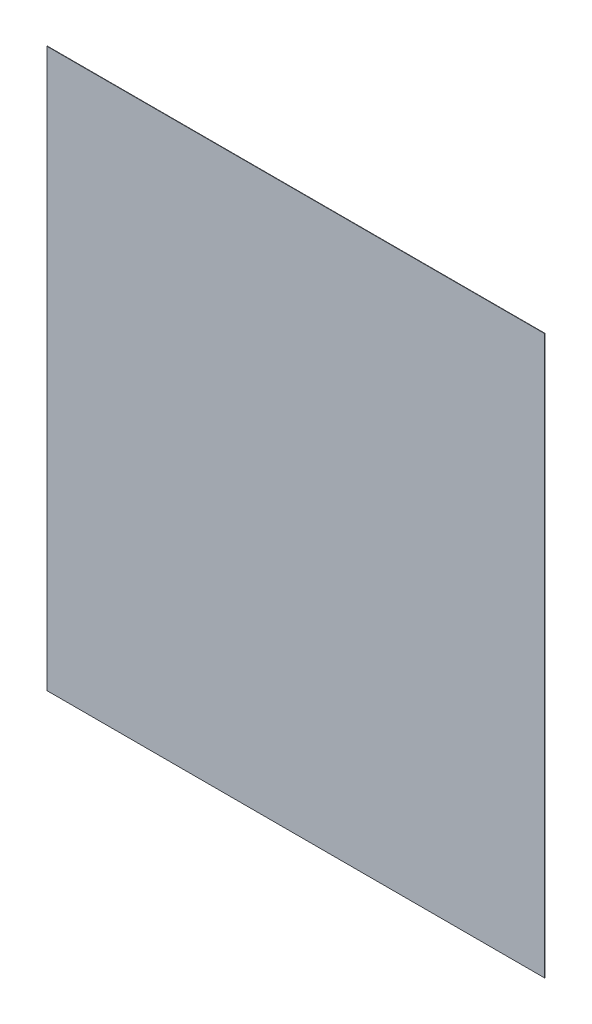
ISO-10303-21;
HEADER;
FILE_DESCRIPTION(('STEP AP214'),'2;1');
FILE_NAME('part.step','',(''),(''),'','','');
FILE_SCHEMA(('AUTOMOTIVE_DESIGN { 1 0 10303 214 1 1 1 1 }'));
ENDSEC;
DATA;
#1=APPLICATION_CONTEXT('core data for automotive mechanical design processes');
#2=APPLICATION_PROTOCOL_DEFINITION('international standard','automotive_design',2000,#1);
#3=PRODUCT_CONTEXT('',#1,'mechanical');
#4=PRODUCT('Part','Part','',(#3));
#5=PRODUCT_RELATED_PRODUCT_CATEGORY('part','',(#4));
#6=PRODUCT_DEFINITION_FORMATION('','',#4);
#7=PRODUCT_DEFINITION_CONTEXT('part definition',#1,'design');
#8=PRODUCT_DEFINITION('design','',#6,#7);
#9=PRODUCT_DEFINITION_SHAPE('','',#8);
#10=(LENGTH_UNIT() NAMED_UNIT(*) SI_UNIT(.MILLI.,.METRE.));
#11=(NAMED_UNIT(*) PLANE_ANGLE_UNIT() SI_UNIT($,.RADIAN.));
#12=(NAMED_UNIT(*) SI_UNIT($,.STERADIAN.) SOLID_ANGLE_UNIT());
#13=UNCERTAINTY_MEASURE_WITH_UNIT(LENGTH_MEASURE(1.E-05),#10,'distance_accuracy_value','');
#14=(GEOMETRIC_REPRESENTATION_CONTEXT(3) GLOBAL_UNCERTAINTY_ASSIGNED_CONTEXT((#13)) GLOBAL_UNIT_ASSIGNED_CONTEXT((#10,
#11,#12)) REPRESENTATION_CONTEXT('',''));
#15=CARTESIAN_POINT('',(0.,0.,0.));
#16=DIRECTION('',(0.,0.,1.));
#17=DIRECTION('',(1.,0.,0.));
#18=AXIS2_PLACEMENT_3D('',#15,#16,#17);
#19=CARTESIAN_POINT('',(62.5,181.5,-758.5));
#20=DIRECTION('',(-1.,0.,0.));
#21=DIRECTION('',(0.,0.,1.));
#22=AXIS2_PLACEMENT_3D('',#19,#20,#21);
#23=PLANE('',#22);
#24=DIRECTION('',(0.,-1.,0.));
#25=VECTOR('',#24,1.);
#26=CARTESIAN_POINT('',(62.5,181.5,-757.5));
#27=LINE('',#26,#25);
#28=CARTESIAN_POINT('',(62.5,1611.,-757.5));
#29=VERTEX_POINT('',#28);
#30=CARTESIAN_POINT('',(62.5,181.5,-757.5));
#31=VERTEX_POINT('',#30);
#32=EDGE_CURVE('E103',#29,#31,#27,.T.);
#33=ORIENTED_EDGE('',*,*,#32,.F.);
#34=DIRECTION('',(0.,0.,1.));
#35=VECTOR('',#34,1.);
#36=CARTESIAN_POINT('',(62.5,1611.,-758.5));
#37=LINE('',#36,#35);
#38=CARTESIAN_POINT('',(62.5,1611.,-758.5));
#39=VERTEX_POINT('',#38);
#40=EDGE_CURVE('E11',#39,#29,#37,.T.);
#41=ORIENTED_EDGE('',*,*,#40,.F.);
#42=DIRECTION('',(0.,-1.,0.));
#43=VECTOR('',#42,1.);
#44=CARTESIAN_POINT('',(62.5,181.5,-758.5));
#45=LINE('',#44,#43);
#46=CARTESIAN_POINT('',(62.5,181.5,-758.5));
#47=VERTEX_POINT('',#46);
#48=EDGE_CURVE('E97',#39,#47,#45,.T.);
#49=ORIENTED_EDGE('',*,*,#48,.T.);
#50=DIRECTION('',(0.,0.,1.));
#51=VECTOR('',#50,1.);
#52=CARTESIAN_POINT('',(62.5,181.5,-758.5));
#53=LINE('',#52,#51);
#54=EDGE_CURVE('E42',#47,#31,#53,.T.);
#55=ORIENTED_EDGE('',*,*,#54,.T.);
#56=EDGE_LOOP('',(#33,#41,#49,#55));
#57=FACE_BOUND('',#56,.T.);
#58=ADVANCED_FACE('F39',(#57),#23,.T.);
#59=CARTESIAN_POINT('',(62.5,1611.,-758.5));
#60=DIRECTION('',(0.,1.,0.));
#61=DIRECTION('',(0.,0.,1.));
#62=AXIS2_PLACEMENT_3D('',#59,#60,#61);
#63=PLANE('',#62);
#64=DIRECTION('',(-1.,0.,0.));
#65=VECTOR('',#64,1.);
#66=CARTESIAN_POINT('',(62.5,1611.,-757.5));
#67=LINE('',#66,#65);
#68=CARTESIAN_POINT('',(1337.5,1611.,-757.5));
#69=VERTEX_POINT('',#68);
#70=EDGE_CURVE('E99',#69,#29,#67,.T.);
#71=ORIENTED_EDGE('',*,*,#70,.F.);
#72=DIRECTION('',(0.,0.,1.));
#73=VECTOR('',#72,1.);
#74=CARTESIAN_POINT('',(1337.5,1611.,-758.5));
#75=LINE('',#74,#73);
#76=CARTESIAN_POINT('',(1337.5,1611.,-758.5));
#77=VERTEX_POINT('',#76);
#78=EDGE_CURVE('E48',#77,#69,#75,.T.);
#79=ORIENTED_EDGE('',*,*,#78,.F.);
#80=DIRECTION('',(-1.,0.,0.));
#81=VECTOR('',#80,1.);
#82=CARTESIAN_POINT('',(62.5,1611.,-758.5));
#83=LINE('',#82,#81);
#84=EDGE_CURVE('E94',#77,#39,#83,.T.);
#85=ORIENTED_EDGE('',*,*,#84,.T.);
#86=ORIENTED_EDGE('',*,*,#40,.T.);
#87=EDGE_LOOP('',(#71,#79,#85,#86));
#88=FACE_BOUND('',#87,.T.);
#89=ADVANCED_FACE('F113',(#88),#63,.T.);
#90=CARTESIAN_POINT('',(1337.5,181.5,-758.5));
#91=DIRECTION('',(1.,0.,0.));
#92=DIRECTION('',(0.,0.,-1.));
#93=AXIS2_PLACEMENT_3D('',#90,#91,#92);
#94=PLANE('',#93);
#95=DIRECTION('',(0.,1.,0.));
#96=VECTOR('',#95,1.);
#97=CARTESIAN_POINT('',(1337.5,181.5,-757.5));
#98=LINE('',#97,#96);
#99=CARTESIAN_POINT('',(1337.5,181.5,-757.5));
#100=VERTEX_POINT('',#99);
#101=EDGE_CURVE('E89',#100,#69,#98,.T.);
#102=ORIENTED_EDGE('',*,*,#101,.F.);
#103=DIRECTION('',(0.,0.,1.));
#104=VECTOR('',#103,1.);
#105=CARTESIAN_POINT('',(1337.5,181.5,-758.5));
#106=LINE('',#105,#104);
#107=CARTESIAN_POINT('',(1337.5,181.5,-758.5));
#108=VERTEX_POINT('',#107);
#109=EDGE_CURVE('E84',#108,#100,#106,.T.);
#110=ORIENTED_EDGE('',*,*,#109,.F.);
#111=DIRECTION('',(0.,1.,0.));
#112=VECTOR('',#111,1.);
#113=CARTESIAN_POINT('',(1337.5,181.5,-758.5));
#114=LINE('',#113,#112);
#115=EDGE_CURVE('E87',#108,#77,#114,.T.);
#116=ORIENTED_EDGE('',*,*,#115,.T.);
#117=ORIENTED_EDGE('',*,*,#78,.T.);
#118=EDGE_LOOP('',(#102,#110,#116,#117));
#119=FACE_BOUND('',#118,.T.);
#120=ADVANCED_FACE('F86',(#119),#94,.T.);
#121=CARTESIAN_POINT('',(62.5,181.5,-758.5));
#122=DIRECTION('',(0.,-1.,0.));
#123=DIRECTION('',(0.,0.,-1.));
#124=AXIS2_PLACEMENT_3D('',#121,#122,#123);
#125=PLANE('',#124);
#126=DIRECTION('',(1.,0.,0.));
#127=VECTOR('',#126,1.);
#128=CARTESIAN_POINT('',(62.5,181.5,-757.5));
#129=LINE('',#128,#127);
#130=EDGE_CURVE('E106',#31,#100,#129,.T.);
#131=ORIENTED_EDGE('',*,*,#130,.F.);
#132=ORIENTED_EDGE('',*,*,#54,.F.);
#133=DIRECTION('',(1.,0.,0.));
#134=VECTOR('',#133,1.);
#135=CARTESIAN_POINT('',(62.5,181.5,-758.5));
#136=LINE('',#135,#134);
#137=EDGE_CURVE('E93',#47,#108,#136,.T.);
#138=ORIENTED_EDGE('',*,*,#137,.T.);
#139=ORIENTED_EDGE('',*,*,#109,.T.);
#140=EDGE_LOOP('',(#131,#132,#138,#139));
#141=FACE_BOUND('',#140,.T.);
#142=ADVANCED_FACE('F96',(#141),#125,.T.);
#143=CARTESIAN_POINT('',(0.,0.,-758.5));
#144=DIRECTION('',(0.,0.,-1.));
#145=DIRECTION('',(-1.,0.,0.));
#146=AXIS2_PLACEMENT_3D('',#143,#144,#145);
#147=PLANE('',#146);
#148=ORIENTED_EDGE('',*,*,#48,.F.);
#149=ORIENTED_EDGE('',*,*,#84,.F.);
#150=ORIENTED_EDGE('',*,*,#115,.F.);
#151=ORIENTED_EDGE('',*,*,#137,.F.);
#152=EDGE_LOOP('',(#148,#149,#150,#151));
#153=FACE_BOUND('',#152,.T.);
#154=ADVANCED_FACE('F92',(#153),#147,.T.);
#155=CARTESIAN_POINT('',(0.,0.,-757.5));
#156=DIRECTION('',(0.,0.,-1.));
#157=DIRECTION('',(-1.,0.,0.));
#158=AXIS2_PLACEMENT_3D('',#155,#156,#157);
#159=PLANE('',#158);
#160=ORIENTED_EDGE('',*,*,#32,.T.);
#161=ORIENTED_EDGE('',*,*,#130,.T.);
#162=ORIENTED_EDGE('',*,*,#101,.T.);
#163=ORIENTED_EDGE('',*,*,#70,.T.);
#164=EDGE_LOOP('',(#160,#161,#162,#163));
#165=FACE_BOUND('',#164,.T.);
#166=ADVANCED_FACE('F112',(#165),#159,.F.);
#167=CLOSED_SHELL('',(#58,#89,#120,#142,#154,#166));
#168=MANIFOLD_SOLID_BREP('B2',#167);
#169=ADVANCED_BREP_SHAPE_REPRESENTATION('',(#18,#168),#14);
#170=SHAPE_DEFINITION_REPRESENTATION(#9,#169);
ENDSEC;
END-ISO-10303-21;
